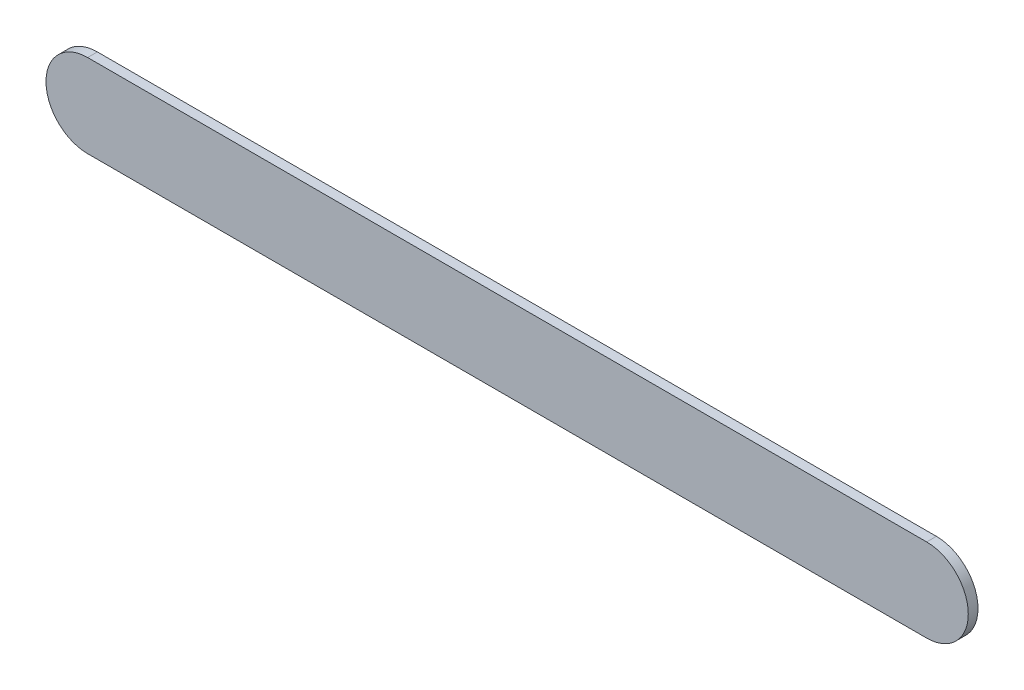
ISO-10303-21;
HEADER;
FILE_DESCRIPTION(('STEP AP214'),'2;1');
FILE_NAME('part.step','',(''),(''),'','','');
FILE_SCHEMA(('AUTOMOTIVE_DESIGN { 1 0 10303 214 1 1 1 1 }'));
ENDSEC;
DATA;
#1=APPLICATION_CONTEXT('core data for automotive mechanical design processes');
#2=APPLICATION_PROTOCOL_DEFINITION('international standard','automotive_design',2000,#1);
#3=PRODUCT_CONTEXT('',#1,'mechanical');
#4=PRODUCT('Part','Part','',(#3));
#5=PRODUCT_RELATED_PRODUCT_CATEGORY('part','',(#4));
#6=PRODUCT_DEFINITION_FORMATION('','',#4);
#7=PRODUCT_DEFINITION_CONTEXT('part definition',#1,'design');
#8=PRODUCT_DEFINITION('design','',#6,#7);
#9=PRODUCT_DEFINITION_SHAPE('','',#8);
#10=(LENGTH_UNIT() NAMED_UNIT(*) SI_UNIT(.MILLI.,.METRE.));
#11=(NAMED_UNIT(*) PLANE_ANGLE_UNIT() SI_UNIT($,.RADIAN.));
#12=(NAMED_UNIT(*) SI_UNIT($,.STERADIAN.) SOLID_ANGLE_UNIT());
#13=UNCERTAINTY_MEASURE_WITH_UNIT(LENGTH_MEASURE(1.E-05),#10,'distance_accuracy_value','');
#14=(GEOMETRIC_REPRESENTATION_CONTEXT(3) GLOBAL_UNCERTAINTY_ASSIGNED_CONTEXT((#13)) GLOBAL_UNIT_ASSIGNED_CONTEXT((#10,
#11,#12)) REPRESENTATION_CONTEXT('',''));
#15=CARTESIAN_POINT('',(0.,0.,0.));
#16=DIRECTION('',(0.,0.,1.));
#17=DIRECTION('',(1.,0.,0.));
#18=AXIS2_PLACEMENT_3D('',#15,#16,#17);
#19=CARTESIAN_POINT('',(129.018,-116.904,1.635));
#20=DIRECTION('',(0.,0.,1.));
#21=DIRECTION('',(1.,0.,0.));
#22=AXIS2_PLACEMENT_3D('',#19,#20,#21);
#23=PLANE('',#22);
#24=DIRECTION('',(-1.,0.,0.));
#25=VECTOR('',#24,1.);
#26=CARTESIAN_POINT('',(129.018,-116.904,1.635));
#27=LINE('',#26,#25);
#28=CARTESIAN_POINT('',(129.018,-116.904,1.635));
#29=VERTEX_POINT('',#28);
#30=CARTESIAN_POINT('',(125.996,-116.904,1.635));
#31=VERTEX_POINT('',#30);
#32=EDGE_CURVE('E82',#29,#31,#27,.T.);
#33=ORIENTED_EDGE('',*,*,#32,.T.);
#34=CARTESIAN_POINT('',(125.996,-117.054,1.635));
#35=DIRECTION('',(0.,0.,1.));
#36=DIRECTION('',(0.,1.,0.));
#37=AXIS2_PLACEMENT_3D('',#34,#35,#36);
#38=CIRCLE('',#37,0.15);
#39=CARTESIAN_POINT('',(125.996,-117.204,1.635));
#40=VERTEX_POINT('',#39);
#41=EDGE_CURVE('E101',#31,#40,#38,.T.);
#42=ORIENTED_EDGE('',*,*,#41,.T.);
#43=DIRECTION('',(1.,0.,0.));
#44=VECTOR('',#43,1.);
#45=CARTESIAN_POINT('',(125.996,-117.204,1.635));
#46=LINE('',#45,#44);
#47=CARTESIAN_POINT('',(129.018,-117.204,1.635));
#48=VERTEX_POINT('',#47);
#49=EDGE_CURVE('E74',#40,#48,#46,.T.);
#50=ORIENTED_EDGE('',*,*,#49,.T.);
#51=CARTESIAN_POINT('',(129.018,-117.054,1.635));
#52=DIRECTION('',(0.,0.,1.));
#53=DIRECTION('',(-1.894780628694E-13,-1.,0.));
#54=AXIS2_PLACEMENT_3D('',#51,#52,#53);
#55=CIRCLE('',#54,0.15);
#56=EDGE_CURVE('E11',#48,#29,#55,.T.);
#57=ORIENTED_EDGE('',*,*,#56,.T.);
#58=EDGE_LOOP('',(#33,#42,#50,#57));
#59=FACE_BOUND('',#58,.T.);
#60=ADVANCED_FACE('F17',(#59),#23,.T.);
#61=CARTESIAN_POINT('',(129.018,-116.904,1.6));
#62=DIRECTION('',(0.,0.,1.));
#63=DIRECTION('',(1.,0.,0.));
#64=AXIS2_PLACEMENT_3D('',#61,#62,#63);
#65=PLANE('',#64);
#66=CARTESIAN_POINT('',(129.018,-117.054,1.6));
#67=DIRECTION('',(0.,0.,1.));
#68=DIRECTION('',(-1.894780628694E-13,-1.,0.));
#69=AXIS2_PLACEMENT_3D('',#66,#67,#68);
#70=CIRCLE('',#69,0.15);
#71=CARTESIAN_POINT('',(129.018,-117.204,1.6));
#72=VERTEX_POINT('',#71);
#73=CARTESIAN_POINT('',(129.018,-116.904,1.6));
#74=VERTEX_POINT('',#73);
#75=EDGE_CURVE('E25',#72,#74,#70,.T.);
#76=ORIENTED_EDGE('',*,*,#75,.F.);
#77=DIRECTION('',(1.,0.,0.));
#78=VECTOR('',#77,1.);
#79=CARTESIAN_POINT('',(125.996,-117.204,1.6));
#80=LINE('',#79,#78);
#81=CARTESIAN_POINT('',(125.996,-117.204,1.6));
#82=VERTEX_POINT('',#81);
#83=EDGE_CURVE('E98',#82,#72,#80,.T.);
#84=ORIENTED_EDGE('',*,*,#83,.F.);
#85=CARTESIAN_POINT('',(125.996,-117.054,1.6));
#86=DIRECTION('',(0.,0.,1.));
#87=DIRECTION('',(0.,1.,0.));
#88=AXIS2_PLACEMENT_3D('',#85,#86,#87);
#89=CIRCLE('',#88,0.15);
#90=CARTESIAN_POINT('',(125.996,-116.904,1.6));
#91=VERTEX_POINT('',#90);
#92=EDGE_CURVE('E84',#91,#82,#89,.T.);
#93=ORIENTED_EDGE('',*,*,#92,.F.);
#94=DIRECTION('',(-1.,0.,0.));
#95=VECTOR('',#94,1.);
#96=CARTESIAN_POINT('',(129.018,-116.904,1.6));
#97=LINE('',#96,#95);
#98=EDGE_CURVE('E80',#74,#91,#97,.T.);
#99=ORIENTED_EDGE('',*,*,#98,.F.);
#100=EDGE_LOOP('',(#76,#84,#93,#99));
#101=FACE_BOUND('',#100,.T.);
#102=ADVANCED_FACE('F86',(#101),#65,.F.);
#103=CARTESIAN_POINT('',(129.018,-117.054,1.6));
#104=DIRECTION('',(0.,0.,-1.));
#105=DIRECTION('',(-1.894780628694E-13,-1.,0.));
#106=AXIS2_PLACEMENT_3D('',#103,#104,#105);
#107=CYLINDRICAL_SURFACE('',#106,0.15);
#108=ORIENTED_EDGE('',*,*,#75,.T.);
#109=DIRECTION('',(0.,0.,1.));
#110=VECTOR('',#109,1.);
#111=CARTESIAN_POINT('',(129.018,-116.904,1.6));
#112=LINE('',#111,#110);
#113=EDGE_CURVE('E68',#74,#29,#112,.T.);
#114=ORIENTED_EDGE('',*,*,#113,.T.);
#115=ORIENTED_EDGE('',*,*,#56,.F.);
#116=DIRECTION('',(0.,0.,1.));
#117=VECTOR('',#116,1.);
#118=CARTESIAN_POINT('',(129.018,-117.204,1.6));
#119=LINE('',#118,#117);
#120=EDGE_CURVE('E71',#72,#48,#119,.T.);
#121=ORIENTED_EDGE('',*,*,#120,.F.);
#122=EDGE_LOOP('',(#108,#114,#115,#121));
#123=FACE_BOUND('',#122,.T.);
#124=ADVANCED_FACE('F67',(#123),#107,.T.);
#125=CARTESIAN_POINT('',(125.996,-117.204,1.6));
#126=DIRECTION('',(0.,1.,0.));
#127=DIRECTION('',(1.,0.,0.));
#128=AXIS2_PLACEMENT_3D('',#125,#126,#127);
#129=PLANE('',#128);
#130=ORIENTED_EDGE('',*,*,#83,.T.);
#131=ORIENTED_EDGE('',*,*,#120,.T.);
#132=ORIENTED_EDGE('',*,*,#49,.F.);
#133=DIRECTION('',(0.,0.,1.));
#134=VECTOR('',#133,1.);
#135=CARTESIAN_POINT('',(125.996,-117.204,1.6));
#136=LINE('',#135,#134);
#137=EDGE_CURVE('E106',#82,#40,#136,.T.);
#138=ORIENTED_EDGE('',*,*,#137,.F.);
#139=EDGE_LOOP('',(#130,#131,#132,#138));
#140=FACE_BOUND('',#139,.T.);
#141=ADVANCED_FACE('F120',(#140),#129,.F.);
#142=CARTESIAN_POINT('',(125.996,-117.054,1.6));
#143=DIRECTION('',(0.,0.,-1.));
#144=DIRECTION('',(0.,1.,0.));
#145=AXIS2_PLACEMENT_3D('',#142,#143,#144);
#146=CYLINDRICAL_SURFACE('',#145,0.15);
#147=ORIENTED_EDGE('',*,*,#92,.T.);
#148=ORIENTED_EDGE('',*,*,#137,.T.);
#149=ORIENTED_EDGE('',*,*,#41,.F.);
#150=DIRECTION('',(0.,0.,1.));
#151=VECTOR('',#150,1.);
#152=CARTESIAN_POINT('',(125.996,-116.904,1.6));
#153=LINE('',#152,#151);
#154=EDGE_CURVE('E90',#91,#31,#153,.T.);
#155=ORIENTED_EDGE('',*,*,#154,.F.);
#156=EDGE_LOOP('',(#147,#148,#149,#155));
#157=FACE_BOUND('',#156,.T.);
#158=ADVANCED_FACE('F122',(#157),#146,.T.);
#159=CARTESIAN_POINT('',(129.018,-116.904,1.6));
#160=DIRECTION('',(0.,-1.,0.));
#161=DIRECTION('',(0.,0.,-1.));
#162=AXIS2_PLACEMENT_3D('',#159,#160,#161);
#163=PLANE('',#162);
#164=ORIENTED_EDGE('',*,*,#98,.T.);
#165=ORIENTED_EDGE('',*,*,#154,.T.);
#166=ORIENTED_EDGE('',*,*,#32,.F.);
#167=ORIENTED_EDGE('',*,*,#113,.F.);
#168=EDGE_LOOP('',(#164,#165,#166,#167));
#169=FACE_BOUND('',#168,.T.);
#170=ADVANCED_FACE('F78',(#169),#163,.F.);
#171=CLOSED_SHELL('',(#60,#102,#124,#141,#158,#170));
#172=MANIFOLD_SOLID_BREP('B1',#171);
#173=ADVANCED_BREP_SHAPE_REPRESENTATION('',(#18,#172),#14);
#174=SHAPE_DEFINITION_REPRESENTATION(#9,#173);
ENDSEC;
END-ISO-10303-21;
